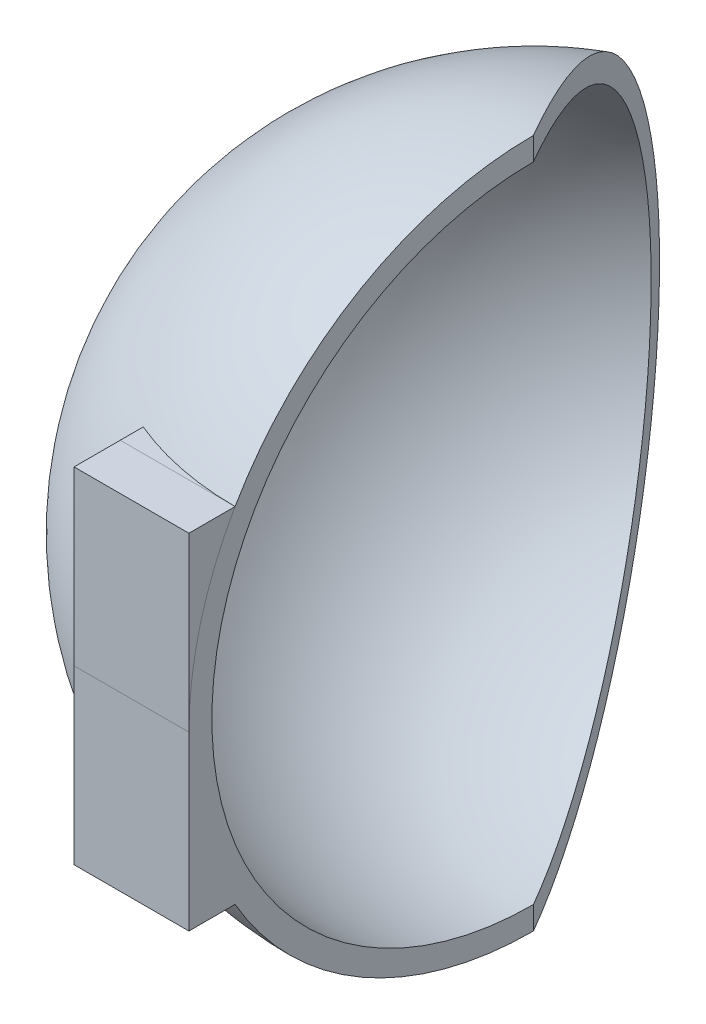
ISO-10303-21;
HEADER;
FILE_DESCRIPTION(('STEP AP214'),'2;1');
FILE_NAME('part.step','',(''),(''),'','','');
FILE_SCHEMA(('AUTOMOTIVE_DESIGN { 1 0 10303 214 1 1 1 1 }'));
ENDSEC;
DATA;
#1=APPLICATION_CONTEXT('core data for automotive mechanical design processes');
#2=APPLICATION_PROTOCOL_DEFINITION('international standard','automotive_design',2000,#1);
#3=PRODUCT_CONTEXT('',#1,'mechanical');
#4=PRODUCT('Part','Part','',(#3));
#5=PRODUCT_RELATED_PRODUCT_CATEGORY('part','',(#4));
#6=PRODUCT_DEFINITION_FORMATION('','',#4);
#7=PRODUCT_DEFINITION_CONTEXT('part definition',#1,'design');
#8=PRODUCT_DEFINITION('design','',#6,#7);
#9=PRODUCT_DEFINITION_SHAPE('','',#8);
#10=(LENGTH_UNIT() NAMED_UNIT(*) SI_UNIT(.MILLI.,.METRE.));
#11=(NAMED_UNIT(*) PLANE_ANGLE_UNIT() SI_UNIT($,.RADIAN.));
#12=(NAMED_UNIT(*) SI_UNIT($,.STERADIAN.) SOLID_ANGLE_UNIT());
#13=UNCERTAINTY_MEASURE_WITH_UNIT(LENGTH_MEASURE(1.E-05),#10,'distance_accuracy_value','');
#14=(GEOMETRIC_REPRESENTATION_CONTEXT(3) GLOBAL_UNCERTAINTY_ASSIGNED_CONTEXT((#13)) GLOBAL_UNIT_ASSIGNED_CONTEXT((#10,
#11,#12)) REPRESENTATION_CONTEXT('',''));
#15=CARTESIAN_POINT('',(0.,0.,0.));
#16=DIRECTION('',(0.,0.,1.));
#17=DIRECTION('',(1.,0.,0.));
#18=AXIS2_PLACEMENT_3D('',#15,#16,#17);
#19=CARTESIAN_POINT('',(-10.,15.,0.));
#20=DIRECTION('',(0.,-1.,0.));
#21=DIRECTION('',(0.,0.,-1.));
#22=AXIS2_PLACEMENT_3D('',#19,#20,#21);
#23=PLANE('',#22);
#24=DIRECTION('',(0.,0.,-1.));
#25=VECTOR('',#24,1.);
#26=CARTESIAN_POINT('',(0.,15.,0.));
#27=LINE('',#26,#25);
#28=CARTESIAN_POINT('',(0.,15.,30.));
#29=VERTEX_POINT('',#28);
#30=CARTESIAN_POINT('',(0.,15.,25.9807621135332));
#31=VERTEX_POINT('',#30);
#32=EDGE_CURVE('E104',#29,#31,#27,.T.);
#33=ORIENTED_EDGE('',*,*,#32,.T.);
#34=DIRECTION('',(1.,0.,0.));
#35=VECTOR('',#34,1.);
#36=CARTESIAN_POINT('',(-10.,15.,25.9807621135332));
#37=LINE('',#36,#35);
#38=CARTESIAN_POINT('',(-10.,15.,25.9807621135332));
#39=VERTEX_POINT('',#38);
#40=EDGE_CURVE('E12',#39,#31,#37,.T.);
#41=ORIENTED_EDGE('',*,*,#40,.F.);
#42=DIRECTION('',(0.,0.,-1.));
#43=VECTOR('',#42,1.);
#44=CARTESIAN_POINT('',(-10.,15.,0.));
#45=LINE('',#44,#43);
#46=CARTESIAN_POINT('',(-10.,15.,30.));
#47=VERTEX_POINT('',#46);
#48=EDGE_CURVE('E91',#47,#39,#45,.T.);
#49=ORIENTED_EDGE('',*,*,#48,.F.);
#50=DIRECTION('',(1.,0.,0.));
#51=VECTOR('',#50,1.);
#52=CARTESIAN_POINT('',(-10.,15.,30.));
#53=LINE('',#52,#51);
#54=EDGE_CURVE('E54',#47,#29,#53,.T.);
#55=ORIENTED_EDGE('',*,*,#54,.T.);
#56=EDGE_LOOP('',(#33,#41,#49,#55));
#57=FACE_BOUND('',#56,.T.);
#58=ADVANCED_FACE('F51',(#57),#23,.F.);
#59=CARTESIAN_POINT('',(-10.,0.,0.));
#60=DIRECTION('',(1.,0.,0.));
#61=DIRECTION('',(0.,0.,-1.));
#62=AXIS2_PLACEMENT_3D('',#59,#60,#61);
#63=CYLINDRICAL_SURFACE('',#62,30.);
#64=CARTESIAN_POINT('',(0.,0.,0.));
#65=DIRECTION('',(1.,0.,0.));
#66=DIRECTION('',(0.,0.,-1.));
#67=AXIS2_PLACEMENT_3D('',#64,#65,#66);
#68=CIRCLE('',#67,30.);
#69=CARTESIAN_POINT('',(0.,0.,30.));
#70=VERTEX_POINT('',#69);
#71=EDGE_CURVE('E79',#31,#70,#68,.T.);
#72=ORIENTED_EDGE('',*,*,#71,.T.);
#73=DIRECTION('',(1.,0.,0.));
#74=VECTOR('',#73,1.);
#75=CARTESIAN_POINT('',(-10.,0.,30.));
#76=LINE('',#75,#74);
#77=CARTESIAN_POINT('',(-10.,0.,30.));
#78=VERTEX_POINT('',#77);
#79=EDGE_CURVE('E60',#78,#70,#76,.T.);
#80=ORIENTED_EDGE('',*,*,#79,.F.);
#81=CARTESIAN_POINT('',(-10.,0.,0.));
#82=DIRECTION('',(1.,0.,0.));
#83=DIRECTION('',(0.,0.,-1.));
#84=AXIS2_PLACEMENT_3D('',#81,#82,#83);
#85=CIRCLE('',#84,30.);
#86=EDGE_CURVE('E68',#39,#78,#85,.T.);
#87=ORIENTED_EDGE('',*,*,#86,.F.);
#88=ORIENTED_EDGE('',*,*,#40,.T.);
#89=EDGE_LOOP('',(#72,#80,#87,#88));
#90=FACE_BOUND('',#89,.T.);
#91=ADVANCED_FACE('F115',(#90),#63,.F.);
#92=CARTESIAN_POINT('',(-10.,0.,30.));
#93=DIRECTION('',(0.,0.,-1.));
#94=DIRECTION('',(-1.,0.,0.));
#95=AXIS2_PLACEMENT_3D('',#92,#93,#94);
#96=PLANE('',#95);
#97=DIRECTION('',(0.,1.,0.));
#98=VECTOR('',#97,1.);
#99=CARTESIAN_POINT('',(0.,0.,30.));
#100=LINE('',#99,#98);
#101=EDGE_CURVE('E97',#70,#29,#100,.T.);
#102=ORIENTED_EDGE('',*,*,#101,.T.);
#103=ORIENTED_EDGE('',*,*,#54,.F.);
#104=DIRECTION('',(0.,1.,0.));
#105=VECTOR('',#104,1.);
#106=CARTESIAN_POINT('',(-10.,0.,30.));
#107=LINE('',#106,#105);
#108=EDGE_CURVE('E87',#78,#47,#107,.T.);
#109=ORIENTED_EDGE('',*,*,#108,.F.);
#110=ORIENTED_EDGE('',*,*,#79,.T.);
#111=EDGE_LOOP('',(#102,#103,#109,#110));
#112=FACE_BOUND('',#111,.T.);
#113=ADVANCED_FACE('F96',(#112),#96,.F.);
#114=CARTESIAN_POINT('',(-10.,0.,0.));
#115=DIRECTION('',(1.,0.,0.));
#116=DIRECTION('',(0.,0.,-1.));
#117=AXIS2_PLACEMENT_3D('',#114,#115,#116);
#118=PLANE('',#117);
#119=ORIENTED_EDGE('',*,*,#48,.T.);
#120=ORIENTED_EDGE('',*,*,#86,.T.);
#121=ORIENTED_EDGE('',*,*,#108,.T.);
#122=EDGE_LOOP('',(#119,#120,#121));
#123=FACE_BOUND('',#122,.T.);
#124=ADVANCED_FACE('F89',(#123),#118,.F.);
#125=CARTESIAN_POINT('',(0.,0.,0.));
#126=DIRECTION('',(1.,0.,0.));
#127=DIRECTION('',(0.,0.,-1.));
#128=AXIS2_PLACEMENT_3D('',#125,#126,#127);
#129=PLANE('',#128);
#130=ORIENTED_EDGE('',*,*,#32,.F.);
#131=ORIENTED_EDGE('',*,*,#101,.F.);
#132=ORIENTED_EDGE('',*,*,#71,.F.);
#133=EDGE_LOOP('',(#130,#131,#132));
#134=FACE_BOUND('',#133,.T.);
#135=ADVANCED_FACE('F106',(#134),#129,.T.);
#136=CLOSED_SHELL('',(#58,#91,#113,#124,#135));
#137=MANIFOLD_SOLID_BREP('B2',#136);
#138=CARTESIAN_POINT('',(30.001,0.,0.));
#139=DIRECTION('',(-1.,0.,0.));
#140=DIRECTION('',(0.,0.,1.));
#141=AXIS2_PLACEMENT_3D('',#138,#139,#140);
#142=CYLINDRICAL_SURFACE('',#141,30.);
#143=DIRECTION('',(1.,0.,0.));
#144=VECTOR('',#143,1.);
#145=CARTESIAN_POINT('',(-10.,0.,30.));
#146=LINE('',#145,#144);
#147=CARTESIAN_POINT('',(-10.,0.,30.));
#148=VERTEX_POINT('',#147);
#149=CARTESIAN_POINT('',(0.,0.,30.));
#150=VERTEX_POINT('',#149);
#151=EDGE_CURVE('E264',#148,#150,#146,.T.);
#152=ORIENTED_EDGE('',*,*,#151,.T.);
#153=CARTESIAN_POINT('',(0.,0.,0.));
#154=DIRECTION('',(1.,0.,0.));
#155=DIRECTION('',(0.,0.,-1.));
#156=AXIS2_PLACEMENT_3D('',#153,#154,#155);
#157=CIRCLE('',#156,30.);
#158=CARTESIAN_POINT('',(0.,15.,25.9807621135332));
#159=VERTEX_POINT('',#158);
#160=EDGE_CURVE('E228',#159,#150,#157,.T.);
#161=ORIENTED_EDGE('',*,*,#160,.F.);
#162=DIRECTION('',(-1.,0.,0.));
#163=VECTOR('',#162,1.);
#164=CARTESIAN_POINT('',(30.001,15.,25.9807621135332));
#165=LINE('',#164,#163);
#166=CARTESIAN_POINT('',(-10.,15.,25.9807621135332));
#167=VERTEX_POINT('',#166);
#168=EDGE_CURVE('E242',#159,#167,#165,.T.);
#169=ORIENTED_EDGE('',*,*,#168,.T.);
#170=CARTESIAN_POINT('',(-10.,0.,0.));
#171=DIRECTION('',(-1.,0.,0.));
#172=DIRECTION('',(0.,0.,1.));
#173=AXIS2_PLACEMENT_3D('',#170,#171,#172);
#174=CIRCLE('',#173,30.);
#175=EDGE_CURVE('E234',#167,#148,#174,.F.);
#176=ORIENTED_EDGE('',*,*,#175,.T.);
#177=EDGE_LOOP('',(#152,#161,#169,#176));
#178=FACE_BOUND('',#177,.T.);
#179=ADVANCED_FACE('F152',(#178),#142,.T.);
#180=CARTESIAN_POINT('',(0.,0.,0.));
#181=DIRECTION('',(0.,1.,0.));
#182=DIRECTION('',(0.499999999999995,0.,0.866025403784442));
#183=AXIS2_PLACEMENT_3D('',#180,#181,#182);
#184=SPHERICAL_SURFACE('',#183,30.);
#185=CARTESIAN_POINT('',(0.,-15.,0.));
#186=DIRECTION('',(0.,1.,0.));
#187=DIRECTION('',(0.,0.,1.));
#188=AXIS2_PLACEMENT_3D('',#185,#186,#187);
#189=CIRCLE('',#188,25.9807621135332);
#190=CARTESIAN_POINT('',(-10.,-15.,23.9791576165636));
#191=VERTEX_POINT('',#190);
#192=CARTESIAN_POINT('',(0.,-15.,25.9807621135332));
#193=VERTEX_POINT('',#192);
#194=EDGE_CURVE('E225',#191,#193,#189,.T.);
#195=ORIENTED_EDGE('',*,*,#194,.F.);
#196=CARTESIAN_POINT('',(-10.,0.,0.));
#197=DIRECTION('',(-1.,0.,0.));
#198=DIRECTION('',(0.,0.,1.));
#199=AXIS2_PLACEMENT_3D('',#196,#197,#198);
#200=CIRCLE('',#199,28.2842712474619);
#201=CARTESIAN_POINT('',(-10.,15.,23.9791576165636));
#202=VERTEX_POINT('',#201);
#203=EDGE_CURVE('E167',#191,#202,#200,.T.);
#204=ORIENTED_EDGE('',*,*,#203,.T.);
#205=CARTESIAN_POINT('',(0.,15.,0.));
#206=DIRECTION('',(0.,1.,0.));
#207=DIRECTION('',(0.,0.,1.));
#208=AXIS2_PLACEMENT_3D('',#205,#206,#207);
#209=CIRCLE('',#208,25.9807621135332);
#210=EDGE_CURVE('E240',#202,#159,#209,.T.);
#211=ORIENTED_EDGE('',*,*,#210,.T.);
#212=CARTESIAN_POINT('',(0.,30.,0.));
#213=VERTEX_POINT('',#212);
#214=EDGE_CURVE('E175',#213,#159,#157,.T.);
#215=ORIENTED_EDGE('',*,*,#214,.F.);
#216=CARTESIAN_POINT('',(0.,0.,0.));
#217=DIRECTION('',(-0.866025403784442,0.,0.499999999999995));
#218=DIRECTION('',(0.499999999999995,0.,0.866025403784442));
#219=AXIS2_PLACEMENT_3D('',#216,#217,#218);
#220=CIRCLE('',#219,30.);
#221=CARTESIAN_POINT('',(0.,-30.,0.));
#222=VERTEX_POINT('',#221);
#223=EDGE_CURVE('E227',#213,#222,#220,.T.);
#224=ORIENTED_EDGE('',*,*,#223,.T.);
#225=EDGE_CURVE('E214',#193,#222,#157,.T.);
#226=ORIENTED_EDGE('',*,*,#225,.F.);
#227=EDGE_LOOP('',(#195,#204,#211,#215,#224,#226));
#228=FACE_BOUND('',#227,.T.);
#229=ADVANCED_FACE('F224',(#228),#184,.T.);
#230=CARTESIAN_POINT('',(0.,0.,0.));
#231=DIRECTION('',(0.,1.,0.));
#232=DIRECTION('',(-0.499999999999995,0.,-0.866025403784442));
#233=AXIS2_PLACEMENT_3D('',#230,#231,#232);
#234=SPHERICAL_SURFACE('',#233,28.);
#235=CARTESIAN_POINT('',(0.,0.,0.));
#236=DIRECTION('',(-1.,0.,0.));
#237=DIRECTION('',(0.,0.,-1.));
#238=AXIS2_PLACEMENT_3D('',#235,#236,#237);
#239=CIRCLE('',#238,28.);
#240=CARTESIAN_POINT('',(0.,-28.,0.));
#241=VERTEX_POINT('',#240);
#242=CARTESIAN_POINT('',(0.,28.,0.));
#243=VERTEX_POINT('',#242);
#244=EDGE_CURVE('E249',#241,#243,#239,.T.);
#245=ORIENTED_EDGE('',*,*,#244,.F.);
#246=CARTESIAN_POINT('',(0.,0.,0.));
#247=DIRECTION('',(0.866025403784442,0.,-0.499999999999995));
#248=DIRECTION('',(0.499999999999995,0.,0.866025403784442));
#249=AXIS2_PLACEMENT_3D('',#246,#247,#248);
#250=CIRCLE('',#249,28.);
#251=EDGE_CURVE('E160',#241,#243,#250,.T.);
#252=ORIENTED_EDGE('',*,*,#251,.T.);
#253=EDGE_LOOP('',(#245,#252));
#254=FACE_BOUND('',#253,.T.);
#255=ADVANCED_FACE('F154',(#254),#234,.F.);
#256=CARTESIAN_POINT('',(0.,0.,0.));
#257=DIRECTION('',(-0.866025403784442,0.,0.499999999999995));
#258=DIRECTION('',(0.499999999999995,0.,0.866025403784442));
#259=AXIS2_PLACEMENT_3D('',#256,#257,#258);
#260=PLANE('',#259);
#261=ORIENTED_EDGE('',*,*,#223,.F.);
#262=DIRECTION('',(0.,1.,0.));
#263=VECTOR('',#262,1.);
#264=CARTESIAN_POINT('',(0.,30.,0.));
#265=LINE('',#264,#263);
#266=EDGE_CURVE('E49',#243,#213,#265,.T.);
#267=ORIENTED_EDGE('',*,*,#266,.F.);
#268=ORIENTED_EDGE('',*,*,#251,.F.);
#269=DIRECTION('',(0.,1.,0.));
#270=VECTOR('',#269,1.);
#271=CARTESIAN_POINT('',(0.,-28.,0.));
#272=LINE('',#271,#270);
#273=EDGE_CURVE('E253',#222,#241,#272,.T.);
#274=ORIENTED_EDGE('',*,*,#273,.F.);
#275=EDGE_LOOP('',(#261,#267,#268,#274));
#276=FACE_BOUND('',#275,.T.);
#277=ADVANCED_FACE('F258',(#276),#260,.F.);
#278=CARTESIAN_POINT('',(0.,0.,0.));
#279=DIRECTION('',(1.,0.,0.));
#280=DIRECTION('',(0.,0.,-1.));
#281=AXIS2_PLACEMENT_3D('',#278,#279,#280);
#282=PLANE('',#281);
#283=ORIENTED_EDGE('',*,*,#214,.T.);
#284=ORIENTED_EDGE('',*,*,#160,.T.);
#285=DIRECTION('',(0.,-1.,0.));
#286=VECTOR('',#285,1.);
#287=CARTESIAN_POINT('',(0.,0.,30.));
#288=LINE('',#287,#286);
#289=CARTESIAN_POINT('',(0.,-15.,30.));
#290=VERTEX_POINT('',#289);
#291=EDGE_CURVE('E217',#150,#290,#288,.T.);
#292=ORIENTED_EDGE('',*,*,#291,.T.);
#293=DIRECTION('',(0.,0.,-1.));
#294=VECTOR('',#293,1.);
#295=CARTESIAN_POINT('',(0.,-15.,0.));
#296=LINE('',#295,#294);
#297=EDGE_CURVE('E210',#290,#193,#296,.T.);
#298=ORIENTED_EDGE('',*,*,#297,.T.);
#299=ORIENTED_EDGE('',*,*,#225,.T.);
#300=ORIENTED_EDGE('',*,*,#273,.T.);
#301=ORIENTED_EDGE('',*,*,#244,.T.);
#302=ORIENTED_EDGE('',*,*,#266,.T.);
#303=EDGE_LOOP('',(#283,#284,#292,#298,#299,#300,#301,#302));
#304=FACE_BOUND('',#303,.T.);
#305=ADVANCED_FACE('F212',(#304),#282,.T.);
#306=CARTESIAN_POINT('',(-10.,0.,0.));
#307=DIRECTION('',(-1.,0.,0.));
#308=DIRECTION('',(0.,0.,1.));
#309=AXIS2_PLACEMENT_3D('',#306,#307,#308);
#310=PLANE('',#309);
#311=ORIENTED_EDGE('',*,*,#203,.F.);
#312=DIRECTION('',(0.,0.,-1.));
#313=VECTOR('',#312,1.);
#314=CARTESIAN_POINT('',(-10.,-15.,0.));
#315=LINE('',#314,#313);
#316=CARTESIAN_POINT('',(-10.,-15.,30.));
#317=VERTEX_POINT('',#316);
#318=EDGE_CURVE('E231',#317,#191,#315,.T.);
#319=ORIENTED_EDGE('',*,*,#318,.F.);
#320=DIRECTION('',(0.,-1.,0.));
#321=VECTOR('',#320,1.);
#322=CARTESIAN_POINT('',(-10.,0.,30.));
#323=LINE('',#322,#321);
#324=EDGE_CURVE('E232',#148,#317,#323,.T.);
#325=ORIENTED_EDGE('',*,*,#324,.F.);
#326=ORIENTED_EDGE('',*,*,#175,.F.);
#327=DIRECTION('',(0.,0.,-1.));
#328=VECTOR('',#327,1.);
#329=CARTESIAN_POINT('',(-10.,15.,0.));
#330=LINE('',#329,#328);
#331=EDGE_CURVE('E245',#167,#202,#330,.T.);
#332=ORIENTED_EDGE('',*,*,#331,.T.);
#333=EDGE_LOOP('',(#311,#319,#325,#326,#332));
#334=FACE_BOUND('',#333,.T.);
#335=ADVANCED_FACE('F268',(#334),#310,.T.);
#336=CARTESIAN_POINT('',(30.001,15.,0.));
#337=DIRECTION('',(0.,1.,0.));
#338=DIRECTION('',(0.,0.,1.));
#339=AXIS2_PLACEMENT_3D('',#336,#337,#338);
#340=PLANE('',#339);
#341=ORIENTED_EDGE('',*,*,#210,.F.);
#342=ORIENTED_EDGE('',*,*,#331,.F.);
#343=ORIENTED_EDGE('',*,*,#168,.F.);
#344=EDGE_LOOP('',(#341,#342,#343));
#345=FACE_BOUND('',#344,.T.);
#346=ADVANCED_FACE('F267',(#345),#340,.T.);
#347=CARTESIAN_POINT('',(30.001,-15.,0.));
#348=DIRECTION('',(0.,-1.,0.));
#349=DIRECTION('',(0.,0.,1.));
#350=AXIS2_PLACEMENT_3D('',#347,#348,#349);
#351=PLANE('',#350);
#352=ORIENTED_EDGE('',*,*,#194,.T.);
#353=ORIENTED_EDGE('',*,*,#297,.F.);
#354=DIRECTION('',(1.,0.,0.));
#355=VECTOR('',#354,1.);
#356=CARTESIAN_POINT('',(-10.,-15.,30.));
#357=LINE('',#356,#355);
#358=EDGE_CURVE('E222',#317,#290,#357,.T.);
#359=ORIENTED_EDGE('',*,*,#358,.F.);
#360=ORIENTED_EDGE('',*,*,#318,.T.);
#361=EDGE_LOOP('',(#352,#353,#359,#360));
#362=FACE_BOUND('',#361,.T.);
#363=ADVANCED_FACE('F230',(#362),#351,.T.);
#364=CARTESIAN_POINT('',(-10.,0.,30.));
#365=DIRECTION('',(0.,0.,-1.));
#366=DIRECTION('',(-1.,0.,0.));
#367=AXIS2_PLACEMENT_3D('',#364,#365,#366);
#368=PLANE('',#367);
#369=ORIENTED_EDGE('',*,*,#291,.F.);
#370=ORIENTED_EDGE('',*,*,#151,.F.);
#371=ORIENTED_EDGE('',*,*,#324,.T.);
#372=ORIENTED_EDGE('',*,*,#358,.T.);
#373=EDGE_LOOP('',(#369,#370,#371,#372));
#374=FACE_BOUND('',#373,.T.);
#375=ADVANCED_FACE('F270',(#374),#368,.F.);
#376=CLOSED_SHELL('',(#179,#229,#255,#277,#305,#335,#346,#363,#375));
#377=MANIFOLD_SOLID_BREP('B6',#376);
#378=ADVANCED_BREP_SHAPE_REPRESENTATION('',(#18,#137,#377),#14);
#379=SHAPE_DEFINITION_REPRESENTATION(#9,#378);
ENDSEC;
END-ISO-10303-21;
